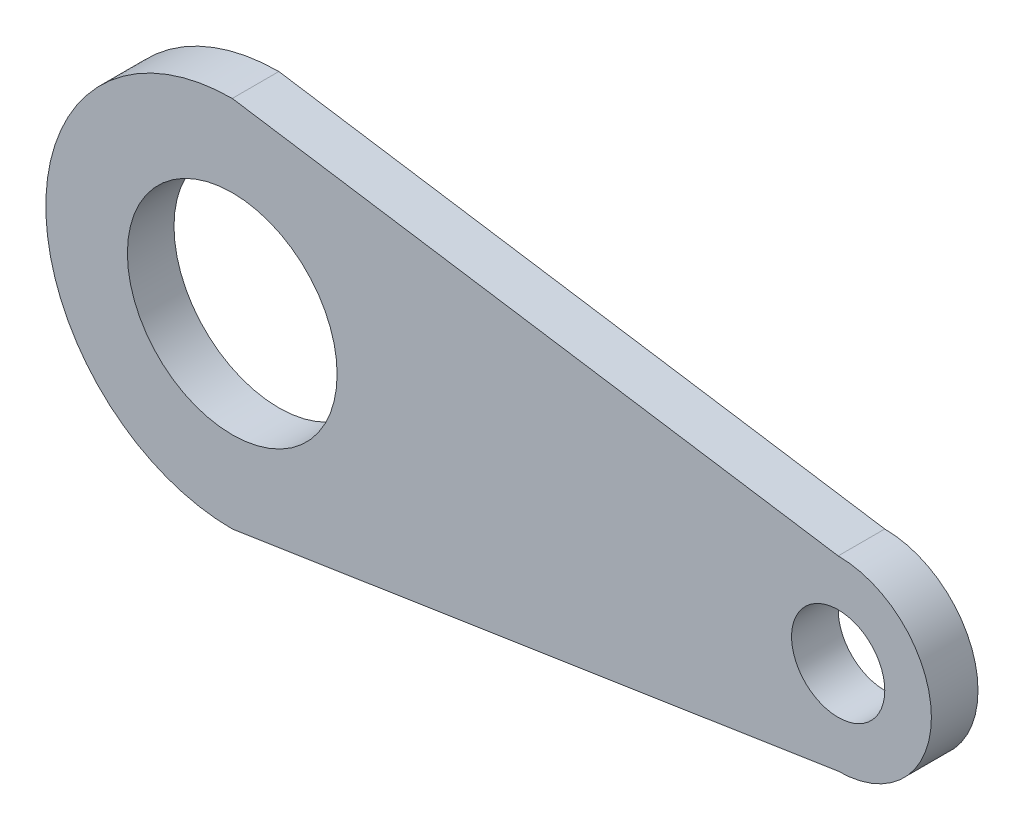
ISO-10303-21;
HEADER;
FILE_DESCRIPTION(('STEP AP214'),'2;1');
FILE_NAME('part.step','',(''),(''),'','','');
FILE_SCHEMA(('AUTOMOTIVE_DESIGN { 1 0 10303 214 1 1 1 1 }'));
ENDSEC;
DATA;
#1=APPLICATION_CONTEXT('core data for automotive mechanical design processes');
#2=APPLICATION_PROTOCOL_DEFINITION('international standard','automotive_design',2000,#1);
#3=PRODUCT_CONTEXT('',#1,'mechanical');
#4=PRODUCT('Part','Part','',(#3));
#5=PRODUCT_RELATED_PRODUCT_CATEGORY('part','',(#4));
#6=PRODUCT_DEFINITION_FORMATION('','',#4);
#7=PRODUCT_DEFINITION_CONTEXT('part definition',#1,'design');
#8=PRODUCT_DEFINITION('design','',#6,#7);
#9=PRODUCT_DEFINITION_SHAPE('','',#8);
#10=(LENGTH_UNIT() NAMED_UNIT(*) SI_UNIT(.MILLI.,.METRE.));
#11=(NAMED_UNIT(*) PLANE_ANGLE_UNIT() SI_UNIT($,.RADIAN.));
#12=(NAMED_UNIT(*) SI_UNIT($,.STERADIAN.) SOLID_ANGLE_UNIT());
#13=UNCERTAINTY_MEASURE_WITH_UNIT(LENGTH_MEASURE(1.E-05),#10,'distance_accuracy_value','');
#14=(GEOMETRIC_REPRESENTATION_CONTEXT(3) GLOBAL_UNCERTAINTY_ASSIGNED_CONTEXT((#13)) GLOBAL_UNIT_ASSIGNED_CONTEXT((#10,
#11,#12)) REPRESENTATION_CONTEXT('',''));
#15=CARTESIAN_POINT('',(0.,0.,0.));
#16=DIRECTION('',(0.,0.,1.));
#17=DIRECTION('',(1.,0.,0.));
#18=AXIS2_PLACEMENT_3D('',#15,#16,#17);
#19=CARTESIAN_POINT('',(-57.0433145009416,0.,10.));
#20=DIRECTION('',(0.,0.,1.));
#21=DIRECTION('',(1.,0.,0.));
#22=AXIS2_PLACEMENT_3D('',#19,#20,#21);
#23=PLANE('',#22);
#24=CARTESIAN_POINT('',(72.9566854990584,0.,10.));
#25=DIRECTION('',(0.,0.,1.));
#26=DIRECTION('',(1.,0.,0.));
#27=AXIS2_PLACEMENT_3D('',#24,#25,#26);
#28=CIRCLE('',#27,9.99999999999999);
#29=CARTESIAN_POINT('',(82.9566854990584,0.,10.));
#30=VERTEX_POINT('',#29);
#31=EDGE_CURVE('E100',#30,#30,#28,.T.);
#32=ORIENTED_EDGE('',*,*,#31,.F.);
#33=EDGE_LOOP('',(#32));
#34=FACE_BOUND('',#33,.T.);
#35=CARTESIAN_POINT('',(-57.0433145009416,0.,10.));
#36=DIRECTION('',(0.,0.,1.));
#37=DIRECTION('',(1.,0.,0.));
#38=AXIS2_PLACEMENT_3D('',#35,#36,#37);
#39=CIRCLE('',#38,40.);
#40=CARTESIAN_POINT('',(-57.0433145009416,40.,10.));
#41=VERTEX_POINT('',#40);
#42=CARTESIAN_POINT('',(-57.0433145009416,-40.,10.));
#43=VERTEX_POINT('',#42);
#44=EDGE_CURVE('E85',#41,#43,#39,.T.);
#45=ORIENTED_EDGE('',*,*,#44,.T.);
#46=DIRECTION('',(0.988371697650617,0.152057184253941,0.));
#47=VECTOR('',#46,1.);
#48=CARTESIAN_POINT('',(-57.0433145009416,-40.,10.));
#49=LINE('',#48,#47);
#50=CARTESIAN_POINT('',(72.9566854990584,-20.,10.));
#51=VERTEX_POINT('',#50);
#52=EDGE_CURVE('E80',#43,#51,#49,.T.);
#53=ORIENTED_EDGE('',*,*,#52,.T.);
#54=CARTESIAN_POINT('',(72.9566854990584,0.,10.));
#55=DIRECTION('',(0.,0.,1.));
#56=DIRECTION('',(1.,0.,0.));
#57=AXIS2_PLACEMENT_3D('',#54,#55,#56);
#58=CIRCLE('',#57,20.);
#59=CARTESIAN_POINT('',(72.9566854990584,20.,10.));
#60=VERTEX_POINT('',#59);
#61=EDGE_CURVE('E83',#51,#60,#58,.T.);
#62=ORIENTED_EDGE('',*,*,#61,.T.);
#63=DIRECTION('',(-0.988371697650617,0.152057184253941,0.));
#64=VECTOR('',#63,1.);
#65=CARTESIAN_POINT('',(-57.0433145009416,40.,10.));
#66=LINE('',#65,#64);
#67=EDGE_CURVE('E50',#60,#41,#66,.T.);
#68=ORIENTED_EDGE('',*,*,#67,.T.);
#69=EDGE_LOOP('',(#45,#53,#62,#68));
#70=FACE_BOUND('',#69,.T.);
#71=CARTESIAN_POINT('',(-57.0433145009416,0.,10.));
#72=DIRECTION('',(0.,0.,1.));
#73=DIRECTION('',(1.,0.,0.));
#74=AXIS2_PLACEMENT_3D('',#71,#72,#73);
#75=CIRCLE('',#74,22.5);
#76=CARTESIAN_POINT('',(-34.5433145009416,0.,10.));
#77=VERTEX_POINT('',#76);
#78=EDGE_CURVE('E115',#77,#77,#75,.T.);
#79=ORIENTED_EDGE('',*,*,#78,.F.);
#80=EDGE_LOOP('',(#79));
#81=FACE_BOUND('',#80,.T.);
#82=ADVANCED_FACE('F33',(#34,#70,#81),#23,.T.);
#83=CARTESIAN_POINT('',(-57.0433145009416,0.,0.));
#84=DIRECTION('',(0.,0.,1.));
#85=DIRECTION('',(1.,0.,0.));
#86=AXIS2_PLACEMENT_3D('',#83,#84,#85);
#87=PLANE('',#86);
#88=CARTESIAN_POINT('',(-57.0433145009416,0.,0.));
#89=DIRECTION('',(0.,0.,1.));
#90=DIRECTION('',(1.,0.,0.));
#91=AXIS2_PLACEMENT_3D('',#88,#89,#90);
#92=CIRCLE('',#91,40.);
#93=CARTESIAN_POINT('',(-57.0433145009416,40.,0.));
#94=VERTEX_POINT('',#93);
#95=CARTESIAN_POINT('',(-57.0433145009416,-40.,0.));
#96=VERTEX_POINT('',#95);
#97=EDGE_CURVE('E97',#94,#96,#92,.T.);
#98=ORIENTED_EDGE('',*,*,#97,.F.);
#99=DIRECTION('',(-0.988371697650617,0.152057184253941,0.));
#100=VECTOR('',#99,1.);
#101=CARTESIAN_POINT('',(-57.0433145009416,40.,0.));
#102=LINE('',#101,#100);
#103=CARTESIAN_POINT('',(72.9566854990584,20.,0.));
#104=VERTEX_POINT('',#103);
#105=EDGE_CURVE('E73',#104,#94,#102,.T.);
#106=ORIENTED_EDGE('',*,*,#105,.F.);
#107=CARTESIAN_POINT('',(72.9566854990584,0.,0.));
#108=DIRECTION('',(0.,0.,1.));
#109=DIRECTION('',(1.,0.,0.));
#110=AXIS2_PLACEMENT_3D('',#107,#108,#109);
#111=CIRCLE('',#110,20.);
#112=CARTESIAN_POINT('',(72.9566854990584,-20.,0.));
#113=VERTEX_POINT('',#112);
#114=EDGE_CURVE('E67',#113,#104,#111,.T.);
#115=ORIENTED_EDGE('',*,*,#114,.F.);
#116=DIRECTION('',(0.988371697650617,0.152057184253941,0.));
#117=VECTOR('',#116,1.);
#118=CARTESIAN_POINT('',(-57.0433145009416,-40.,0.));
#119=LINE('',#118,#117);
#120=EDGE_CURVE('E89',#96,#113,#119,.T.);
#121=ORIENTED_EDGE('',*,*,#120,.F.);
#122=EDGE_LOOP('',(#98,#106,#115,#121));
#123=FACE_BOUND('',#122,.T.);
#124=CARTESIAN_POINT('',(72.9566854990584,0.,0.));
#125=DIRECTION('',(0.,0.,1.));
#126=DIRECTION('',(1.,0.,0.));
#127=AXIS2_PLACEMENT_3D('',#124,#125,#126);
#128=CIRCLE('',#127,9.99999999999999);
#129=CARTESIAN_POINT('',(82.9566854990584,0.,0.));
#130=VERTEX_POINT('',#129);
#131=EDGE_CURVE('E112',#130,#130,#128,.T.);
#132=ORIENTED_EDGE('',*,*,#131,.T.);
#133=EDGE_LOOP('',(#132));
#134=FACE_BOUND('',#133,.T.);
#135=CARTESIAN_POINT('',(-57.0433145009416,0.,0.));
#136=DIRECTION('',(0.,0.,1.));
#137=DIRECTION('',(1.,0.,0.));
#138=AXIS2_PLACEMENT_3D('',#135,#136,#137);
#139=CIRCLE('',#138,22.5);
#140=CARTESIAN_POINT('',(-34.5433145009416,0.,0.));
#141=VERTEX_POINT('',#140);
#142=EDGE_CURVE('E118',#141,#141,#139,.T.);
#143=ORIENTED_EDGE('',*,*,#142,.T.);
#144=EDGE_LOOP('',(#143));
#145=FACE_BOUND('',#144,.T.);
#146=ADVANCED_FACE('F108',(#123,#134,#145),#87,.F.);
#147=CARTESIAN_POINT('',(-57.0433145009416,0.,10.));
#148=DIRECTION('',(0.,0.,-1.));
#149=DIRECTION('',(-1.,0.,0.));
#150=AXIS2_PLACEMENT_3D('',#147,#148,#149);
#151=CYLINDRICAL_SURFACE('',#150,40.);
#152=ORIENTED_EDGE('',*,*,#97,.T.);
#153=DIRECTION('',(0.,0.,-1.));
#154=VECTOR('',#153,1.);
#155=CARTESIAN_POINT('',(-57.0433145009416,-40.,10.));
#156=LINE('',#155,#154);
#157=EDGE_CURVE('E11',#43,#96,#156,.T.);
#158=ORIENTED_EDGE('',*,*,#157,.F.);
#159=ORIENTED_EDGE('',*,*,#44,.F.);
#160=DIRECTION('',(0.,0.,-1.));
#161=VECTOR('',#160,1.);
#162=CARTESIAN_POINT('',(-57.0433145009416,40.,10.));
#163=LINE('',#162,#161);
#164=EDGE_CURVE('E93',#41,#94,#163,.T.);
#165=ORIENTED_EDGE('',*,*,#164,.T.);
#166=EDGE_LOOP('',(#152,#158,#159,#165));
#167=FACE_BOUND('',#166,.T.);
#168=ADVANCED_FACE('F35',(#167),#151,.T.);
#169=CARTESIAN_POINT('',(-57.0433145009416,-40.,10.));
#170=DIRECTION('',(-0.152057184253941,0.988371697650617,0.));
#171=DIRECTION('',(-0.988371697650617,-0.152057184253941,0.));
#172=AXIS2_PLACEMENT_3D('',#169,#170,#171);
#173=PLANE('',#172);
#174=ORIENTED_EDGE('',*,*,#120,.T.);
#175=DIRECTION('',(0.,0.,-1.));
#176=VECTOR('',#175,1.);
#177=CARTESIAN_POINT('',(72.9566854990584,-20.,10.));
#178=LINE('',#177,#176);
#179=EDGE_CURVE('E42',#51,#113,#178,.T.);
#180=ORIENTED_EDGE('',*,*,#179,.F.);
#181=ORIENTED_EDGE('',*,*,#52,.F.);
#182=ORIENTED_EDGE('',*,*,#157,.T.);
#183=EDGE_LOOP('',(#174,#180,#181,#182));
#184=FACE_BOUND('',#183,.T.);
#185=ADVANCED_FACE('F88',(#184),#173,.F.);
#186=CARTESIAN_POINT('',(72.9566854990584,0.,10.));
#187=DIRECTION('',(0.,0.,-1.));
#188=DIRECTION('',(-1.,0.,0.));
#189=AXIS2_PLACEMENT_3D('',#186,#187,#188);
#190=CYLINDRICAL_SURFACE('',#189,20.);
#191=ORIENTED_EDGE('',*,*,#114,.T.);
#192=DIRECTION('',(0.,0.,-1.));
#193=VECTOR('',#192,1.);
#194=CARTESIAN_POINT('',(72.9566854990584,20.,10.));
#195=LINE('',#194,#193);
#196=EDGE_CURVE('E90',#60,#104,#195,.T.);
#197=ORIENTED_EDGE('',*,*,#196,.F.);
#198=ORIENTED_EDGE('',*,*,#61,.F.);
#199=ORIENTED_EDGE('',*,*,#179,.T.);
#200=EDGE_LOOP('',(#191,#197,#198,#199));
#201=FACE_BOUND('',#200,.T.);
#202=ADVANCED_FACE('F91',(#201),#190,.T.);
#203=CARTESIAN_POINT('',(-57.0433145009416,40.,10.));
#204=DIRECTION('',(-0.152057184253941,-0.988371697650617,0.));
#205=DIRECTION('',(0.988371697650617,-0.152057184253941,0.));
#206=AXIS2_PLACEMENT_3D('',#203,#204,#205);
#207=PLANE('',#206);
#208=ORIENTED_EDGE('',*,*,#105,.T.);
#209=ORIENTED_EDGE('',*,*,#164,.F.);
#210=ORIENTED_EDGE('',*,*,#67,.F.);
#211=ORIENTED_EDGE('',*,*,#196,.T.);
#212=EDGE_LOOP('',(#208,#209,#210,#211));
#213=FACE_BOUND('',#212,.T.);
#214=ADVANCED_FACE('F105',(#213),#207,.F.);
#215=CARTESIAN_POINT('',(72.9566854990584,0.,10.));
#216=DIRECTION('',(0.,0.,-1.));
#217=DIRECTION('',(-1.,0.,0.));
#218=AXIS2_PLACEMENT_3D('',#215,#216,#217);
#219=CYLINDRICAL_SURFACE('',#218,9.99999999999999);
#220=ORIENTED_EDGE('',*,*,#31,.T.);
#221=EDGE_LOOP('',(#220));
#222=FACE_BOUND('',#221,.T.);
#223=ORIENTED_EDGE('',*,*,#131,.F.);
#224=EDGE_LOOP('',(#223));
#225=FACE_BOUND('',#224,.T.);
#226=ADVANCED_FACE('F135',(#222,#225),#219,.F.);
#227=CARTESIAN_POINT('',(-57.0433145009416,0.,10.));
#228=DIRECTION('',(0.,0.,-1.));
#229=DIRECTION('',(-1.,0.,0.));
#230=AXIS2_PLACEMENT_3D('',#227,#228,#229);
#231=CYLINDRICAL_SURFACE('',#230,22.5);
#232=ORIENTED_EDGE('',*,*,#78,.T.);
#233=EDGE_LOOP('',(#232));
#234=FACE_BOUND('',#233,.T.);
#235=ORIENTED_EDGE('',*,*,#142,.F.);
#236=EDGE_LOOP('',(#235));
#237=FACE_BOUND('',#236,.T.);
#238=ADVANCED_FACE('F124',(#234,#237),#231,.F.);
#239=CLOSED_SHELL('',(#82,#146,#168,#185,#202,#214,#226,#238));
#240=MANIFOLD_SOLID_BREP('B2',#239);
#241=ADVANCED_BREP_SHAPE_REPRESENTATION('',(#18,#240),#14);
#242=SHAPE_DEFINITION_REPRESENTATION(#9,#241);
ENDSEC;
END-ISO-10303-21;
